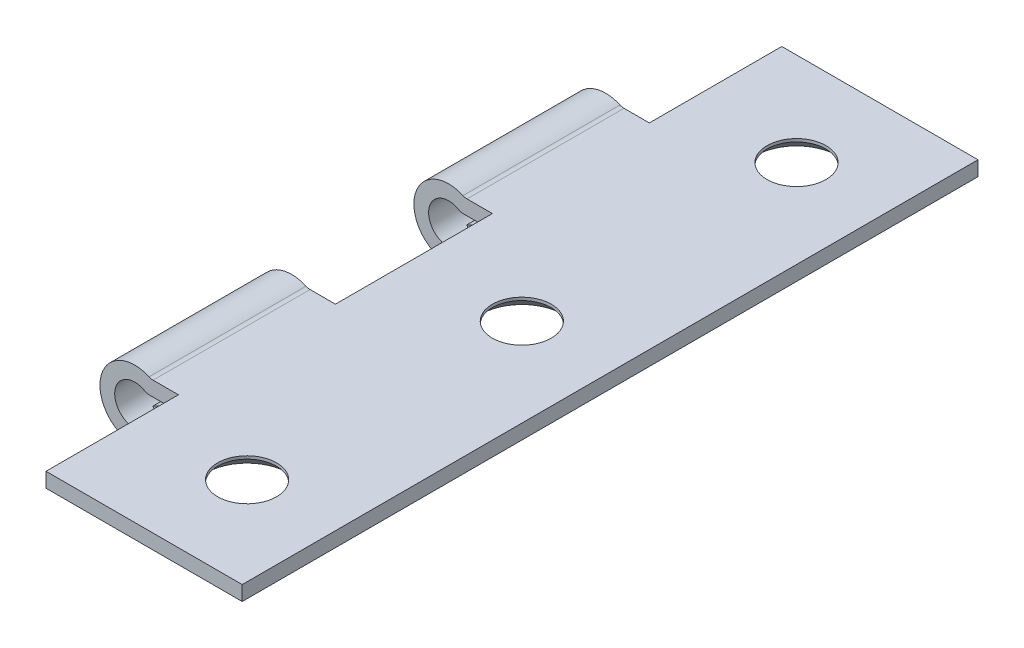
ISO-10303-21;
HEADER;
FILE_DESCRIPTION(('STEP AP214'),'2;1');
FILE_NAME('part.step','',(''),(''),'','','');
FILE_SCHEMA(('AUTOMOTIVE_DESIGN { 1 0 10303 214 1 1 1 1 }'));
ENDSEC;
DATA;
#1=APPLICATION_CONTEXT('core data for automotive mechanical design processes');
#2=APPLICATION_PROTOCOL_DEFINITION('international standard','automotive_design',2000,#1);
#3=PRODUCT_CONTEXT('',#1,'mechanical');
#4=PRODUCT('Part','Part','',(#3));
#5=PRODUCT_RELATED_PRODUCT_CATEGORY('part','',(#4));
#6=PRODUCT_DEFINITION_FORMATION('','',#4);
#7=PRODUCT_DEFINITION_CONTEXT('part definition',#1,'design');
#8=PRODUCT_DEFINITION('design','',#6,#7);
#9=PRODUCT_DEFINITION_SHAPE('','',#8);
#10=(LENGTH_UNIT() NAMED_UNIT(*) SI_UNIT(.MILLI.,.METRE.));
#11=(NAMED_UNIT(*) PLANE_ANGLE_UNIT() SI_UNIT($,.RADIAN.));
#12=(NAMED_UNIT(*) SI_UNIT($,.STERADIAN.) SOLID_ANGLE_UNIT());
#13=UNCERTAINTY_MEASURE_WITH_UNIT(LENGTH_MEASURE(1.E-05),#10,'distance_accuracy_value','');
#14=(GEOMETRIC_REPRESENTATION_CONTEXT(3) GLOBAL_UNCERTAINTY_ASSIGNED_CONTEXT((#13)) GLOBAL_UNIT_ASSIGNED_CONTEXT((#10,
#11,#12)) REPRESENTATION_CONTEXT('',''));
#15=CARTESIAN_POINT('',(0.,0.,0.));
#16=DIRECTION('',(0.,0.,1.));
#17=DIRECTION('',(1.,0.,0.));
#18=AXIS2_PLACEMENT_3D('',#15,#16,#17);
#19=CARTESIAN_POINT('',(0.,0.,37.5));
#20=DIRECTION('',(0.,0.,-1.));
#21=DIRECTION('',(-1.,0.,0.));
#22=AXIS2_PLACEMENT_3D('',#19,#20,#21);
#23=CYLINDRICAL_SURFACE('',#22,3.55);
#24=CARTESIAN_POINT('',(0.,0.,24.));
#25=DIRECTION('',(0.,0.,-1.));
#26=DIRECTION('',(-1.,0.,0.));
#27=AXIS2_PLACEMENT_3D('',#24,#25,#26);
#28=CIRCLE('',#27,3.55);
#29=CARTESIAN_POINT('',(3.21739264398012,1.50029482917946,24.));
#30=VERTEX_POINT('',#29);
#31=CARTESIAN_POINT('',(1.45548112696551,3.23791208791209,24.));
#32=VERTEX_POINT('',#31);
#33=EDGE_CURVE('E219',#30,#32,#28,.T.);
#34=ORIENTED_EDGE('',*,*,#33,.T.);
#35=DIRECTION('',(0.,0.,-1.));
#36=VECTOR('',#35,1.);
#37=CARTESIAN_POINT('',(1.45548112696551,3.23791208791209,37.5));
#38=LINE('',#37,#36);
#39=CARTESIAN_POINT('',(1.45548112696551,3.23791208791209,8.));
#40=VERTEX_POINT('',#39);
#41=EDGE_CURVE('E290',#32,#40,#38,.T.);
#42=ORIENTED_EDGE('',*,*,#41,.T.);
#43=CARTESIAN_POINT('',(0.,0.,8.));
#44=DIRECTION('',(0.,0.,1.));
#45=DIRECTION('',(1.,0.,0.));
#46=AXIS2_PLACEMENT_3D('',#43,#44,#45);
#47=CIRCLE('',#46,3.55);
#48=CARTESIAN_POINT('',(3.21739264398012,1.50029482917946,8.));
#49=VERTEX_POINT('',#48);
#50=EDGE_CURVE('E259',#40,#49,#47,.T.);
#51=ORIENTED_EDGE('',*,*,#50,.T.);
#52=DIRECTION('',(0.,0.,-1.));
#53=VECTOR('',#52,1.);
#54=CARTESIAN_POINT('',(3.21739264398012,1.50029482917946,37.5));
#55=LINE('',#54,#53);
#56=EDGE_CURVE('E310',#30,#49,#55,.T.);
#57=ORIENTED_EDGE('',*,*,#56,.F.);
#58=EDGE_LOOP('',(#34,#42,#51,#57));
#59=FACE_BOUND('',#58,.T.);
#60=ADVANCED_FACE('F34',(#59),#23,.T.);
#61=CARTESIAN_POINT('',(0.,0.,-24.));
#62=DIRECTION('',(0.,0.,1.));
#63=DIRECTION('',(1.,0.,0.));
#64=AXIS2_PLACEMENT_3D('',#61,#62,#63);
#65=CIRCLE('',#64,3.55);
#66=CARTESIAN_POINT('',(1.45548112696551,3.23791208791209,-24.));
#67=VERTEX_POINT('',#66);
#68=CARTESIAN_POINT('',(3.21739264398012,1.50029482917946,-24.));
#69=VERTEX_POINT('',#68);
#70=EDGE_CURVE('E182',#67,#69,#65,.T.);
#71=ORIENTED_EDGE('',*,*,#70,.T.);
#72=CARTESIAN_POINT('',(3.21739264398012,1.50029482917946,-8.));
#73=VERTEX_POINT('',#72);
#74=EDGE_CURVE('E309',#73,#69,#55,.T.);
#75=ORIENTED_EDGE('',*,*,#74,.F.);
#76=CARTESIAN_POINT('',(0.,0.,-8.));
#77=DIRECTION('',(0.,0.,-1.));
#78=DIRECTION('',(-1.,0.,0.));
#79=AXIS2_PLACEMENT_3D('',#76,#77,#78);
#80=CIRCLE('',#79,3.55);
#81=CARTESIAN_POINT('',(1.45548112696551,3.23791208791209,-8.));
#82=VERTEX_POINT('',#81);
#83=EDGE_CURVE('E242',#73,#82,#80,.T.);
#84=ORIENTED_EDGE('',*,*,#83,.T.);
#85=EDGE_CURVE('E285',#82,#67,#38,.T.);
#86=ORIENTED_EDGE('',*,*,#85,.T.);
#87=EDGE_LOOP('',(#71,#75,#84,#86));
#88=FACE_BOUND('',#87,.T.);
#89=ADVANCED_FACE('F367',(#88),#23,.T.);
#90=CARTESIAN_POINT('',(3.21739264398012,1.50029482917946,37.5));
#91=DIRECTION('',(0.422618261740694,-0.906307787036652,0.));
#92=DIRECTION('',(0.906307787036652,0.422618261740694,0.));
#93=AXIS2_PLACEMENT_3D('',#90,#91,#92);
#94=PLANE('',#93);
#95=DIRECTION('',(0.,0.,-1.));
#96=VECTOR('',#95,1.);
#97=CARTESIAN_POINT('',(1.85793096342514,0.866367436568422,37.5));
#98=LINE('',#97,#96);
#99=CARTESIAN_POINT('',(1.85793096342514,0.866367436568422,24.));
#100=VERTEX_POINT('',#99);
#101=CARTESIAN_POINT('',(1.85793096342514,0.866367436568422,8.));
#102=VERTEX_POINT('',#101);
#103=EDGE_CURVE('E307',#100,#102,#98,.T.);
#104=ORIENTED_EDGE('',*,*,#103,.F.);
#105=DIRECTION('',(0.906307787036652,0.422618261740694,0.));
#106=VECTOR('',#105,1.);
#107=CARTESIAN_POINT('',(3.21739264398012,1.50029482917946,24.));
#108=LINE('',#107,#106);
#109=EDGE_CURVE('E221',#100,#30,#108,.T.);
#110=ORIENTED_EDGE('',*,*,#109,.T.);
#111=ORIENTED_EDGE('',*,*,#56,.T.);
#112=DIRECTION('',(-0.906307787036652,-0.422618261740694,0.));
#113=VECTOR('',#112,1.);
#114=CARTESIAN_POINT('',(3.21739264398012,1.50029482917946,8.));
#115=LINE('',#114,#113);
#116=EDGE_CURVE('E262',#49,#102,#115,.T.);
#117=ORIENTED_EDGE('',*,*,#116,.T.);
#118=EDGE_LOOP('',(#104,#110,#111,#117));
#119=FACE_BOUND('',#118,.T.);
#120=ADVANCED_FACE('F373',(#119),#94,.F.);
#121=CARTESIAN_POINT('',(0.,0.,37.5));
#122=DIRECTION('',(0.,0.,-1.));
#123=DIRECTION('',(-1.,0.,0.));
#124=AXIS2_PLACEMENT_3D('',#121,#122,#123);
#125=CYLINDRICAL_SURFACE('',#124,2.05);
#126=DIRECTION('',(0.,0.,-1.));
#127=VECTOR('',#126,1.);
#128=CARTESIAN_POINT('',(1.01489577654459,1.78114754098361,37.5));
#129=LINE('',#128,#127);
#130=CARTESIAN_POINT('',(1.01489577654459,1.78114754098361,24.));
#131=VERTEX_POINT('',#130);
#132=CARTESIAN_POINT('',(1.01489577654459,1.78114754098361,8.));
#133=VERTEX_POINT('',#132);
#134=EDGE_CURVE('E304',#131,#133,#129,.T.);
#135=ORIENTED_EDGE('',*,*,#134,.F.);
#136=CARTESIAN_POINT('',(0.,0.,24.));
#137=DIRECTION('',(0.,0.,-1.));
#138=DIRECTION('',(-1.,0.,0.));
#139=AXIS2_PLACEMENT_3D('',#136,#137,#138);
#140=CIRCLE('',#139,2.05);
#141=EDGE_CURVE('E224',#131,#100,#140,.F.);
#142=ORIENTED_EDGE('',*,*,#141,.T.);
#143=ORIENTED_EDGE('',*,*,#103,.T.);
#144=CARTESIAN_POINT('',(0.,0.,8.));
#145=DIRECTION('',(0.,0.,1.));
#146=DIRECTION('',(1.,0.,0.));
#147=AXIS2_PLACEMENT_3D('',#144,#145,#146);
#148=CIRCLE('',#147,2.05);
#149=EDGE_CURVE('E265',#102,#133,#148,.F.);
#150=ORIENTED_EDGE('',*,*,#149,.T.);
#151=EDGE_LOOP('',(#135,#142,#143,#150));
#152=FACE_BOUND('',#151,.T.);
#153=ADVANCED_FACE('F386',(#152),#125,.F.);
#154=CARTESIAN_POINT('',(1.50996688705415,2.65,37.5));
#155=DIRECTION('',(0.,0.,-1.));
#156=DIRECTION('',(-1.,0.,0.));
#157=AXIS2_PLACEMENT_3D('',#154,#155,#156);
#158=CYLINDRICAL_SURFACE('',#157,1.);
#159=DIRECTION('',(0.,0.,-1.));
#160=VECTOR('',#159,1.);
#161=CARTESIAN_POINT('',(1.50996688705415,1.65,37.5));
#162=LINE('',#161,#160);
#163=CARTESIAN_POINT('',(1.50996688705415,1.65,24.));
#164=VERTEX_POINT('',#163);
#165=CARTESIAN_POINT('',(1.50996688705415,1.65,8.));
#166=VERTEX_POINT('',#165);
#167=EDGE_CURVE('E301',#164,#166,#162,.T.);
#168=ORIENTED_EDGE('',*,*,#167,.F.);
#169=CARTESIAN_POINT('',(1.50996688705415,2.65,24.));
#170=DIRECTION('',(0.,0.,-1.));
#171=DIRECTION('',(-1.,0.,0.));
#172=AXIS2_PLACEMENT_3D('',#169,#170,#171);
#173=CIRCLE('',#172,1.);
#174=EDGE_CURVE('E227',#164,#131,#173,.T.);
#175=ORIENTED_EDGE('',*,*,#174,.T.);
#176=ORIENTED_EDGE('',*,*,#134,.T.);
#177=CARTESIAN_POINT('',(1.50996688705415,2.65,8.));
#178=DIRECTION('',(0.,0.,1.));
#179=DIRECTION('',(1.,0.,0.));
#180=AXIS2_PLACEMENT_3D('',#177,#178,#179);
#181=CIRCLE('',#180,1.);
#182=EDGE_CURVE('E268',#133,#166,#181,.T.);
#183=ORIENTED_EDGE('',*,*,#182,.T.);
#184=EDGE_LOOP('',(#168,#175,#176,#183));
#185=FACE_BOUND('',#184,.T.);
#186=ADVANCED_FACE('F391',(#185),#158,.T.);
#187=CARTESIAN_POINT('',(1.86547581061776,4.15,37.5));
#188=DIRECTION('',(0.,0.,-1.));
#189=DIRECTION('',(-1.,0.,0.));
#190=AXIS2_PLACEMENT_3D('',#187,#188,#189);
#191=CYLINDRICAL_SURFACE('',#190,1.);
#192=ORIENTED_EDGE('',*,*,#41,.F.);
#193=CARTESIAN_POINT('',(1.86547581061776,4.15,24.));
#194=DIRECTION('',(0.,0.,-1.));
#195=DIRECTION('',(-1.,0.,0.));
#196=AXIS2_PLACEMENT_3D('',#193,#194,#195);
#197=CIRCLE('',#196,1.);
#198=CARTESIAN_POINT('',(1.86547581061776,3.15,24.));
#199=VERTEX_POINT('',#198);
#200=EDGE_CURVE('E216',#32,#199,#197,.F.);
#201=ORIENTED_EDGE('',*,*,#200,.T.);
#202=DIRECTION('',(0.,0.,-1.));
#203=VECTOR('',#202,1.);
#204=CARTESIAN_POINT('',(1.86547581061776,3.15,37.5));
#205=LINE('',#204,#203);
#206=CARTESIAN_POINT('',(1.86547581061776,3.15,8.));
#207=VERTEX_POINT('',#206);
#208=EDGE_CURVE('E293',#199,#207,#205,.T.);
#209=ORIENTED_EDGE('',*,*,#208,.T.);
#210=CARTESIAN_POINT('',(1.86547581061776,4.15,8.));
#211=DIRECTION('',(0.,0.,1.));
#212=DIRECTION('',(1.,0.,0.));
#213=AXIS2_PLACEMENT_3D('',#210,#211,#212);
#214=CIRCLE('',#213,1.);
#215=EDGE_CURVE('E315',#207,#40,#214,.F.);
#216=ORIENTED_EDGE('',*,*,#215,.T.);
#217=EDGE_LOOP('',(#192,#201,#209,#216));
#218=FACE_BOUND('',#217,.T.);
#219=ADVANCED_FACE('F380',(#218),#191,.F.);
#220=ORIENTED_EDGE('',*,*,#74,.T.);
#221=DIRECTION('',(-0.906307787036652,-0.422618261740694,0.));
#222=VECTOR('',#221,1.);
#223=CARTESIAN_POINT('',(3.21739264398012,1.50029482917946,-24.));
#224=LINE('',#223,#222);
#225=CARTESIAN_POINT('',(1.85793096342514,0.866367436568422,-24.));
#226=VERTEX_POINT('',#225);
#227=EDGE_CURVE('E205',#69,#226,#224,.T.);
#228=ORIENTED_EDGE('',*,*,#227,.T.);
#229=CARTESIAN_POINT('',(1.85793096342514,0.866367436568422,-8.));
#230=VERTEX_POINT('',#229);
#231=EDGE_CURVE('E306',#230,#226,#98,.T.);
#232=ORIENTED_EDGE('',*,*,#231,.F.);
#233=DIRECTION('',(0.906307787036652,0.422618261740694,0.));
#234=VECTOR('',#233,1.);
#235=CARTESIAN_POINT('',(3.21739264398012,1.50029482917946,-8.));
#236=LINE('',#235,#234);
#237=EDGE_CURVE('E244',#230,#73,#236,.T.);
#238=ORIENTED_EDGE('',*,*,#237,.T.);
#239=EDGE_LOOP('',(#220,#228,#232,#238));
#240=FACE_BOUND('',#239,.T.);
#241=ADVANCED_FACE('F376',(#240),#94,.F.);
#242=ORIENTED_EDGE('',*,*,#231,.T.);
#243=CARTESIAN_POINT('',(0.,0.,-24.));
#244=DIRECTION('',(0.,0.,1.));
#245=DIRECTION('',(1.,0.,0.));
#246=AXIS2_PLACEMENT_3D('',#243,#244,#245);
#247=CIRCLE('',#246,2.05);
#248=CARTESIAN_POINT('',(1.01489577654459,1.78114754098361,-24.));
#249=VERTEX_POINT('',#248);
#250=EDGE_CURVE('E208',#226,#249,#247,.F.);
#251=ORIENTED_EDGE('',*,*,#250,.T.);
#252=CARTESIAN_POINT('',(1.01489577654459,1.78114754098361,-8.));
#253=VERTEX_POINT('',#252);
#254=EDGE_CURVE('E303',#253,#249,#129,.T.);
#255=ORIENTED_EDGE('',*,*,#254,.F.);
#256=CARTESIAN_POINT('',(0.,0.,-8.));
#257=DIRECTION('',(0.,0.,-1.));
#258=DIRECTION('',(-1.,0.,0.));
#259=AXIS2_PLACEMENT_3D('',#256,#257,#258);
#260=CIRCLE('',#259,2.05);
#261=EDGE_CURVE('E247',#253,#230,#260,.F.);
#262=ORIENTED_EDGE('',*,*,#261,.T.);
#263=EDGE_LOOP('',(#242,#251,#255,#262));
#264=FACE_BOUND('',#263,.T.);
#265=ADVANCED_FACE('F379',(#264),#125,.F.);
#266=ORIENTED_EDGE('',*,*,#254,.T.);
#267=CARTESIAN_POINT('',(1.50996688705415,2.65,-24.));
#268=DIRECTION('',(0.,0.,1.));
#269=DIRECTION('',(1.,0.,0.));
#270=AXIS2_PLACEMENT_3D('',#267,#268,#269);
#271=CIRCLE('',#270,1.);
#272=CARTESIAN_POINT('',(1.50996688705415,1.65,-24.));
#273=VERTEX_POINT('',#272);
#274=EDGE_CURVE('E211',#249,#273,#271,.T.);
#275=ORIENTED_EDGE('',*,*,#274,.T.);
#276=CARTESIAN_POINT('',(1.50996688705415,1.65,-8.));
#277=VERTEX_POINT('',#276);
#278=EDGE_CURVE('E300',#277,#273,#162,.T.);
#279=ORIENTED_EDGE('',*,*,#278,.F.);
#280=CARTESIAN_POINT('',(1.50996688705415,2.65,-8.));
#281=DIRECTION('',(0.,0.,-1.));
#282=DIRECTION('',(-1.,0.,0.));
#283=AXIS2_PLACEMENT_3D('',#280,#281,#282);
#284=CIRCLE('',#283,1.);
#285=EDGE_CURVE('E250',#277,#253,#284,.T.);
#286=ORIENTED_EDGE('',*,*,#285,.T.);
#287=EDGE_LOOP('',(#266,#275,#279,#286));
#288=FACE_BOUND('',#287,.T.);
#289=ADVANCED_FACE('F384',(#288),#158,.T.);
#290=CARTESIAN_POINT('',(1.50996688705415,1.65,37.5));
#291=DIRECTION('',(0.,1.,0.));
#292=DIRECTION('',(0.,0.,1.));
#293=AXIS2_PLACEMENT_3D('',#290,#291,#292);
#294=PLANE('',#293);
#295=CARTESIAN_POINT('',(15.45,1.65,-28.));
#296=DIRECTION('',(0.,1.,0.));
#297=DIRECTION('',(0.,0.,1.));
#298=AXIS2_PLACEMENT_3D('',#295,#296,#297);
#299=CIRCLE('',#298,4.20000000000001);
#300=CARTESIAN_POINT('',(15.45,1.65,-23.8));
#301=VERTEX_POINT('',#300);
#302=EDGE_CURVE('E345',#301,#301,#299,.T.);
#303=ORIENTED_EDGE('',*,*,#302,.T.);
#304=EDGE_LOOP('',(#303));
#305=FACE_BOUND('',#304,.T.);
#306=CARTESIAN_POINT('',(15.45,1.65,0.));
#307=DIRECTION('',(0.,1.,0.));
#308=DIRECTION('',(0.,0.,1.));
#309=AXIS2_PLACEMENT_3D('',#306,#307,#308);
#310=CIRCLE('',#309,4.20000000000003);
#311=CARTESIAN_POINT('',(15.45,1.65,4.20000000000003));
#312=VERTEX_POINT('',#311);
#313=EDGE_CURVE('E342',#312,#312,#310,.T.);
#314=ORIENTED_EDGE('',*,*,#313,.T.);
#315=EDGE_LOOP('',(#314));
#316=FACE_BOUND('',#315,.T.);
#317=CARTESIAN_POINT('',(15.45,1.65,28.));
#318=DIRECTION('',(0.,1.,0.));
#319=DIRECTION('',(0.,0.,1.));
#320=AXIS2_PLACEMENT_3D('',#317,#318,#319);
#321=CIRCLE('',#320,4.19999999999998);
#322=CARTESIAN_POINT('',(15.45,1.65,32.2));
#323=VERTEX_POINT('',#322);
#324=EDGE_CURVE('E339',#323,#323,#321,.T.);
#325=ORIENTED_EDGE('',*,*,#324,.T.);
#326=EDGE_LOOP('',(#325));
#327=FACE_BOUND('',#326,.T.);
#328=DIRECTION('',(1.,0.,0.));
#329=VECTOR('',#328,1.);
#330=CARTESIAN_POINT('',(1.50996688705415,1.65,37.5));
#331=LINE('',#330,#329);
#332=CARTESIAN_POINT('',(4.45,1.65,37.5));
#333=VERTEX_POINT('',#332);
#334=CARTESIAN_POINT('',(24.45,1.65,37.5));
#335=VERTEX_POINT('',#334);
#336=EDGE_CURVE('E278',#333,#335,#331,.T.);
#337=ORIENTED_EDGE('',*,*,#336,.F.);
#338=DIRECTION('',(0.,0.,-1.));
#339=VECTOR('',#338,1.);
#340=CARTESIAN_POINT('',(4.45,1.65,37.5));
#341=LINE('',#340,#339);
#342=CARTESIAN_POINT('',(4.45,1.65,24.));
#343=VERTEX_POINT('',#342);
#344=EDGE_CURVE('E49',#333,#343,#341,.T.);
#345=ORIENTED_EDGE('',*,*,#344,.T.);
#346=DIRECTION('',(-1.,0.,0.));
#347=VECTOR('',#346,1.);
#348=CARTESIAN_POINT('',(1.50996688705415,1.65,24.));
#349=LINE('',#348,#347);
#350=EDGE_CURVE('E230',#343,#164,#349,.T.);
#351=ORIENTED_EDGE('',*,*,#350,.T.);
#352=ORIENTED_EDGE('',*,*,#167,.T.);
#353=DIRECTION('',(1.,0.,0.));
#354=VECTOR('',#353,1.);
#355=CARTESIAN_POINT('',(1.50996688705415,1.65,8.));
#356=LINE('',#355,#354);
#357=CARTESIAN_POINT('',(4.45,1.65,8.));
#358=VERTEX_POINT('',#357);
#359=EDGE_CURVE('E271',#166,#358,#356,.T.);
#360=ORIENTED_EDGE('',*,*,#359,.T.);
#361=DIRECTION('',(0.,0.,-1.));
#362=VECTOR('',#361,1.);
#363=CARTESIAN_POINT('',(4.45,1.65,37.5));
#364=LINE('',#363,#362);
#365=CARTESIAN_POINT('',(4.45,1.65,-8.));
#366=VERTEX_POINT('',#365);
#367=EDGE_CURVE('E274',#358,#366,#364,.T.);
#368=ORIENTED_EDGE('',*,*,#367,.T.);
#369=DIRECTION('',(-1.,0.,0.));
#370=VECTOR('',#369,1.);
#371=CARTESIAN_POINT('',(1.50996688705415,1.65,-8.));
#372=LINE('',#371,#370);
#373=EDGE_CURVE('E253',#366,#277,#372,.T.);
#374=ORIENTED_EDGE('',*,*,#373,.T.);
#375=ORIENTED_EDGE('',*,*,#278,.T.);
#376=DIRECTION('',(1.,0.,0.));
#377=VECTOR('',#376,1.);
#378=CARTESIAN_POINT('',(1.50996688705415,1.65,-24.));
#379=LINE('',#378,#377);
#380=CARTESIAN_POINT('',(4.45000000000001,1.65,-24.));
#381=VERTEX_POINT('',#380);
#382=EDGE_CURVE('E214',#273,#381,#379,.T.);
#383=ORIENTED_EDGE('',*,*,#382,.T.);
#384=DIRECTION('',(0.,0.,-1.));
#385=VECTOR('',#384,1.);
#386=CARTESIAN_POINT('',(4.45,1.65,37.5));
#387=LINE('',#386,#385);
#388=CARTESIAN_POINT('',(4.45000000000001,1.65,-37.5));
#389=VERTEX_POINT('',#388);
#390=EDGE_CURVE('E186',#381,#389,#387,.T.);
#391=ORIENTED_EDGE('',*,*,#390,.T.);
#392=DIRECTION('',(1.,0.,0.));
#393=VECTOR('',#392,1.);
#394=CARTESIAN_POINT('',(1.50996688705415,1.65,-37.5));
#395=LINE('',#394,#393);
#396=CARTESIAN_POINT('',(24.45,1.65,-37.5));
#397=VERTEX_POINT('',#396);
#398=EDGE_CURVE('E277',#389,#397,#395,.T.);
#399=ORIENTED_EDGE('',*,*,#398,.T.);
#400=DIRECTION('',(0.,0.,-1.));
#401=VECTOR('',#400,1.);
#402=CARTESIAN_POINT('',(24.45,1.65,37.5));
#403=LINE('',#402,#401);
#404=EDGE_CURVE('E297',#335,#397,#403,.T.);
#405=ORIENTED_EDGE('',*,*,#404,.F.);
#406=EDGE_LOOP('',(#337,#345,#351,#352,#360,#368,#374,#375,#383,#391,#399,#405));
#407=FACE_BOUND('',#406,.T.);
#408=ADVANCED_FACE('F389',(#305,#316,#327,#407),#294,.F.);
#409=CARTESIAN_POINT('',(24.45,3.15,37.5));
#410=DIRECTION('',(-1.,0.,0.));
#411=DIRECTION('',(0.,0.,1.));
#412=AXIS2_PLACEMENT_3D('',#409,#410,#411);
#413=PLANE('',#412);
#414=DIRECTION('',(0.,1.,0.));
#415=VECTOR('',#414,1.);
#416=CARTESIAN_POINT('',(24.45,3.15,-37.5));
#417=LINE('',#416,#415);
#418=CARTESIAN_POINT('',(24.45,3.15,-37.5));
#419=VERTEX_POINT('',#418);
#420=EDGE_CURVE('E287',#397,#419,#417,.T.);
#421=ORIENTED_EDGE('',*,*,#420,.T.);
#422=DIRECTION('',(0.,0.,-1.));
#423=VECTOR('',#422,1.);
#424=CARTESIAN_POINT('',(24.45,3.15,37.5));
#425=LINE('',#424,#423);
#426=CARTESIAN_POINT('',(24.45,3.15,37.5));
#427=VERTEX_POINT('',#426);
#428=EDGE_CURVE('E295',#427,#419,#425,.T.);
#429=ORIENTED_EDGE('',*,*,#428,.F.);
#430=DIRECTION('',(0.,1.,0.));
#431=VECTOR('',#430,1.);
#432=CARTESIAN_POINT('',(24.45,3.15,37.5));
#433=LINE('',#432,#431);
#434=EDGE_CURVE('E280',#335,#427,#433,.T.);
#435=ORIENTED_EDGE('',*,*,#434,.F.);
#436=ORIENTED_EDGE('',*,*,#404,.T.);
#437=EDGE_LOOP('',(#421,#429,#435,#436));
#438=FACE_BOUND('',#437,.T.);
#439=ADVANCED_FACE('F394',(#438),#413,.F.);
#440=CARTESIAN_POINT('',(1.86547581061776,3.15,37.5));
#441=DIRECTION('',(0.,-1.,0.));
#442=DIRECTION('',(1.,0.,0.));
#443=AXIS2_PLACEMENT_3D('',#440,#441,#442);
#444=PLANE('',#443);
#445=CARTESIAN_POINT('',(15.45,3.15,28.));
#446=DIRECTION('',(0.,-1.,0.));
#447=DIRECTION('',(1.,0.,0.));
#448=AXIS2_PLACEMENT_3D('',#445,#446,#447);
#449=CIRCLE('',#448,3.);
#450=CARTESIAN_POINT('',(18.45,3.15,28.));
#451=VERTEX_POINT('',#450);
#452=EDGE_CURVE('E334',#451,#451,#449,.F.);
#453=ORIENTED_EDGE('',*,*,#452,.F.);
#454=EDGE_LOOP('',(#453));
#455=FACE_BOUND('',#454,.T.);
#456=CARTESIAN_POINT('',(15.45,3.15,-28.));
#457=DIRECTION('',(0.,-1.,0.));
#458=DIRECTION('',(1.,0.,0.));
#459=AXIS2_PLACEMENT_3D('',#456,#457,#458);
#460=CIRCLE('',#459,3.);
#461=CARTESIAN_POINT('',(18.45,3.15,-28.));
#462=VERTEX_POINT('',#461);
#463=EDGE_CURVE('E331',#462,#462,#460,.T.);
#464=ORIENTED_EDGE('',*,*,#463,.T.);
#465=EDGE_LOOP('',(#464));
#466=FACE_BOUND('',#465,.T.);
#467=CARTESIAN_POINT('',(15.45,3.15,0.));
#468=DIRECTION('',(0.,-1.,0.));
#469=DIRECTION('',(1.,0.,0.));
#470=AXIS2_PLACEMENT_3D('',#467,#468,#469);
#471=CIRCLE('',#470,3.);
#472=CARTESIAN_POINT('',(18.45,3.15,0.));
#473=VERTEX_POINT('',#472);
#474=EDGE_CURVE('E188',#473,#473,#471,.T.);
#475=ORIENTED_EDGE('',*,*,#474,.T.);
#476=EDGE_LOOP('',(#475));
#477=FACE_BOUND('',#476,.T.);
#478=DIRECTION('',(1.,0.,0.));
#479=VECTOR('',#478,1.);
#480=CARTESIAN_POINT('',(1.86547581061776,3.15,24.));
#481=LINE('',#480,#479);
#482=CARTESIAN_POINT('',(4.45,3.15,24.));
#483=VERTEX_POINT('',#482);
#484=EDGE_CURVE('E326',#199,#483,#481,.T.);
#485=ORIENTED_EDGE('',*,*,#484,.T.);
#486=DIRECTION('',(0.,0.,1.));
#487=VECTOR('',#486,1.);
#488=CARTESIAN_POINT('',(4.45,3.15,37.5));
#489=LINE('',#488,#487);
#490=CARTESIAN_POINT('',(4.45,3.15,37.5));
#491=VERTEX_POINT('',#490);
#492=EDGE_CURVE('E197',#483,#491,#489,.T.);
#493=ORIENTED_EDGE('',*,*,#492,.T.);
#494=DIRECTION('',(-1.,0.,0.));
#495=VECTOR('',#494,1.);
#496=CARTESIAN_POINT('',(1.86547581061776,3.15,37.5));
#497=LINE('',#496,#495);
#498=EDGE_CURVE('E282',#427,#491,#497,.T.);
#499=ORIENTED_EDGE('',*,*,#498,.F.);
#500=ORIENTED_EDGE('',*,*,#428,.T.);
#501=DIRECTION('',(-1.,0.,0.));
#502=VECTOR('',#501,1.);
#503=CARTESIAN_POINT('',(1.86547581061776,3.15,-37.5));
#504=LINE('',#503,#502);
#505=CARTESIAN_POINT('',(4.45000000000001,3.15,-37.5));
#506=VERTEX_POINT('',#505);
#507=EDGE_CURVE('E195',#419,#506,#504,.T.);
#508=ORIENTED_EDGE('',*,*,#507,.T.);
#509=DIRECTION('',(0.,0.,1.));
#510=VECTOR('',#509,1.);
#511=CARTESIAN_POINT('',(4.45,3.15,37.5));
#512=LINE('',#511,#510);
#513=CARTESIAN_POINT('',(4.45000000000001,3.15,-24.));
#514=VERTEX_POINT('',#513);
#515=EDGE_CURVE('E57',#506,#514,#512,.T.);
#516=ORIENTED_EDGE('',*,*,#515,.T.);
#517=DIRECTION('',(-1.,0.,0.));
#518=VECTOR('',#517,1.);
#519=CARTESIAN_POINT('',(1.86547581061776,3.15,-24.));
#520=LINE('',#519,#518);
#521=CARTESIAN_POINT('',(1.86547581061776,3.15,-24.));
#522=VERTEX_POINT('',#521);
#523=EDGE_CURVE('E173',#514,#522,#520,.T.);
#524=ORIENTED_EDGE('',*,*,#523,.T.);
#525=CARTESIAN_POINT('',(1.86547581061776,3.15,-8.));
#526=VERTEX_POINT('',#525);
#527=EDGE_CURVE('E292',#526,#522,#205,.T.);
#528=ORIENTED_EDGE('',*,*,#527,.F.);
#529=DIRECTION('',(1.,0.,0.));
#530=VECTOR('',#529,1.);
#531=CARTESIAN_POINT('',(1.86547581061776,3.15,-8.));
#532=LINE('',#531,#530);
#533=CARTESIAN_POINT('',(4.45,3.15,-8.));
#534=VERTEX_POINT('',#533);
#535=EDGE_CURVE('E237',#526,#534,#532,.T.);
#536=ORIENTED_EDGE('',*,*,#535,.T.);
#537=DIRECTION('',(0.,0.,1.));
#538=VECTOR('',#537,1.);
#539=CARTESIAN_POINT('',(4.45,3.15,37.5));
#540=LINE('',#539,#538);
#541=CARTESIAN_POINT('',(4.45,3.15,8.));
#542=VERTEX_POINT('',#541);
#543=EDGE_CURVE('E318',#534,#542,#540,.T.);
#544=ORIENTED_EDGE('',*,*,#543,.T.);
#545=DIRECTION('',(-1.,0.,0.));
#546=VECTOR('',#545,1.);
#547=CARTESIAN_POINT('',(1.86547581061776,3.15,8.));
#548=LINE('',#547,#546);
#549=EDGE_CURVE('E256',#542,#207,#548,.T.);
#550=ORIENTED_EDGE('',*,*,#549,.T.);
#551=ORIENTED_EDGE('',*,*,#208,.F.);
#552=EDGE_LOOP('',(#485,#493,#499,#500,#508,#516,#524,#528,#536,#544,#550,#551));
#553=FACE_BOUND('',#552,.T.);
#554=ADVANCED_FACE('F192',(#455,#466,#477,#553),#444,.F.);
#555=ORIENTED_EDGE('',*,*,#527,.T.);
#556=CARTESIAN_POINT('',(1.86547581061776,4.15,-24.));
#557=DIRECTION('',(0.,0.,1.));
#558=DIRECTION('',(1.,0.,0.));
#559=AXIS2_PLACEMENT_3D('',#556,#557,#558);
#560=CIRCLE('',#559,1.);
#561=EDGE_CURVE('E178',#522,#67,#560,.F.);
#562=ORIENTED_EDGE('',*,*,#561,.T.);
#563=ORIENTED_EDGE('',*,*,#85,.F.);
#564=CARTESIAN_POINT('',(1.86547581061776,4.15,-8.));
#565=DIRECTION('',(0.,0.,-1.));
#566=DIRECTION('',(-1.,0.,0.));
#567=AXIS2_PLACEMENT_3D('',#564,#565,#566);
#568=CIRCLE('',#567,1.);
#569=EDGE_CURVE('E312',#82,#526,#568,.F.);
#570=ORIENTED_EDGE('',*,*,#569,.T.);
#571=EDGE_LOOP('',(#555,#562,#563,#570));
#572=FACE_BOUND('',#571,.T.);
#573=ADVANCED_FACE('F401',(#572),#191,.F.);
#574=CARTESIAN_POINT('',(0.,0.,37.5));
#575=DIRECTION('',(0.,0.,1.));
#576=DIRECTION('',(1.,0.,0.));
#577=AXIS2_PLACEMENT_3D('',#574,#575,#576);
#578=PLANE('',#577);
#579=DIRECTION('',(0.,1.,0.));
#580=VECTOR('',#579,1.);
#581=CARTESIAN_POINT('',(4.45,0.,37.5));
#582=LINE('',#581,#580);
#583=EDGE_CURVE('E323',#333,#491,#582,.T.);
#584=ORIENTED_EDGE('',*,*,#583,.F.);
#585=ORIENTED_EDGE('',*,*,#336,.T.);
#586=ORIENTED_EDGE('',*,*,#434,.T.);
#587=ORIENTED_EDGE('',*,*,#498,.T.);
#588=EDGE_LOOP('',(#584,#585,#586,#587));
#589=FACE_BOUND('',#588,.T.);
#590=ADVANCED_FACE('F405',(#589),#578,.T.);
#591=CARTESIAN_POINT('',(0.,0.,-37.5));
#592=DIRECTION('',(0.,0.,1.));
#593=DIRECTION('',(1.,0.,0.));
#594=AXIS2_PLACEMENT_3D('',#591,#592,#593);
#595=PLANE('',#594);
#596=ORIENTED_EDGE('',*,*,#398,.F.);
#597=DIRECTION('',(0.,1.,0.));
#598=VECTOR('',#597,1.);
#599=CARTESIAN_POINT('',(4.45000000000001,0.,-37.5));
#600=LINE('',#599,#598);
#601=EDGE_CURVE('E321',#389,#506,#600,.T.);
#602=ORIENTED_EDGE('',*,*,#601,.T.);
#603=ORIENTED_EDGE('',*,*,#507,.F.);
#604=ORIENTED_EDGE('',*,*,#420,.F.);
#605=EDGE_LOOP('',(#596,#602,#603,#604));
#606=FACE_BOUND('',#605,.T.);
#607=ADVANCED_FACE('F407',(#606),#595,.F.);
#608=CARTESIAN_POINT('',(4.45,3.55,8.));
#609=DIRECTION('',(1.,0.,0.));
#610=DIRECTION('',(0.,0.,-1.));
#611=AXIS2_PLACEMENT_3D('',#608,#609,#610);
#612=PLANE('',#611);
#613=DIRECTION('',(0.,-1.,0.));
#614=VECTOR('',#613,1.);
#615=CARTESIAN_POINT('',(4.45,3.55,8.));
#616=LINE('',#615,#614);
#617=EDGE_CURVE('E234',#542,#358,#616,.T.);
#618=ORIENTED_EDGE('',*,*,#617,.F.);
#619=ORIENTED_EDGE('',*,*,#543,.F.);
#620=DIRECTION('',(0.,-1.,0.));
#621=VECTOR('',#620,1.);
#622=CARTESIAN_POINT('',(4.45,3.55,-8.));
#623=LINE('',#622,#621);
#624=EDGE_CURVE('E233',#534,#366,#623,.T.);
#625=ORIENTED_EDGE('',*,*,#624,.T.);
#626=ORIENTED_EDGE('',*,*,#367,.F.);
#627=EDGE_LOOP('',(#618,#619,#625,#626));
#628=FACE_BOUND('',#627,.T.);
#629=ADVANCED_FACE('F410',(#628),#612,.F.);
#630=CARTESIAN_POINT('',(-3.55,3.55,8.));
#631=DIRECTION('',(0.,0.,1.));
#632=DIRECTION('',(1.,0.,0.));
#633=AXIS2_PLACEMENT_3D('',#630,#631,#632);
#634=PLANE('',#633);
#635=ORIENTED_EDGE('',*,*,#182,.F.);
#636=ORIENTED_EDGE('',*,*,#149,.F.);
#637=ORIENTED_EDGE('',*,*,#116,.F.);
#638=ORIENTED_EDGE('',*,*,#50,.F.);
#639=ORIENTED_EDGE('',*,*,#215,.F.);
#640=ORIENTED_EDGE('',*,*,#549,.F.);
#641=ORIENTED_EDGE('',*,*,#617,.T.);
#642=ORIENTED_EDGE('',*,*,#359,.F.);
#643=EDGE_LOOP('',(#635,#636,#637,#638,#639,#640,#641,#642));
#644=FACE_BOUND('',#643,.T.);
#645=ADVANCED_FACE('F418',(#644),#634,.F.);
#646=CARTESIAN_POINT('',(-3.55,3.55,-8.));
#647=DIRECTION('',(0.,0.,-1.));
#648=DIRECTION('',(-1.,0.,0.));
#649=AXIS2_PLACEMENT_3D('',#646,#647,#648);
#650=PLANE('',#649);
#651=ORIENTED_EDGE('',*,*,#624,.F.);
#652=ORIENTED_EDGE('',*,*,#535,.F.);
#653=ORIENTED_EDGE('',*,*,#569,.F.);
#654=ORIENTED_EDGE('',*,*,#83,.F.);
#655=ORIENTED_EDGE('',*,*,#237,.F.);
#656=ORIENTED_EDGE('',*,*,#261,.F.);
#657=ORIENTED_EDGE('',*,*,#285,.F.);
#658=ORIENTED_EDGE('',*,*,#373,.F.);
#659=EDGE_LOOP('',(#651,#652,#653,#654,#655,#656,#657,#658));
#660=FACE_BOUND('',#659,.T.);
#661=ADVANCED_FACE('F415',(#660),#650,.F.);
#662=CARTESIAN_POINT('',(-3.55,3.55,-24.));
#663=DIRECTION('',(0.,0.,1.));
#664=DIRECTION('',(1.,0.,0.));
#665=AXIS2_PLACEMENT_3D('',#662,#663,#664);
#666=PLANE('',#665);
#667=ORIENTED_EDGE('',*,*,#274,.F.);
#668=ORIENTED_EDGE('',*,*,#250,.F.);
#669=ORIENTED_EDGE('',*,*,#227,.F.);
#670=ORIENTED_EDGE('',*,*,#70,.F.);
#671=ORIENTED_EDGE('',*,*,#561,.F.);
#672=ORIENTED_EDGE('',*,*,#523,.F.);
#673=DIRECTION('',(0.,-1.,0.));
#674=VECTOR('',#673,1.);
#675=CARTESIAN_POINT('',(4.45000000000001,3.55,-24.));
#676=LINE('',#675,#674);
#677=EDGE_CURVE('E175',#514,#381,#676,.T.);
#678=ORIENTED_EDGE('',*,*,#677,.T.);
#679=ORIENTED_EDGE('',*,*,#382,.F.);
#680=EDGE_LOOP('',(#667,#668,#669,#670,#671,#672,#678,#679));
#681=FACE_BOUND('',#680,.T.);
#682=ADVANCED_FACE('F174',(#681),#666,.F.);
#683=CARTESIAN_POINT('',(4.45000000000001,3.55,-24.));
#684=DIRECTION('',(1.,0.,0.));
#685=DIRECTION('',(0.,0.,-1.));
#686=AXIS2_PLACEMENT_3D('',#683,#684,#685);
#687=PLANE('',#686);
#688=ORIENTED_EDGE('',*,*,#677,.F.);
#689=ORIENTED_EDGE('',*,*,#515,.F.);
#690=ORIENTED_EDGE('',*,*,#601,.F.);
#691=ORIENTED_EDGE('',*,*,#390,.F.);
#692=EDGE_LOOP('',(#688,#689,#690,#691));
#693=FACE_BOUND('',#692,.T.);
#694=ADVANCED_FACE('F184',(#693),#687,.F.);
#695=CARTESIAN_POINT('',(-3.55000000000001,3.55,24.));
#696=DIRECTION('',(0.,0.,-1.));
#697=DIRECTION('',(-1.,0.,0.));
#698=AXIS2_PLACEMENT_3D('',#695,#696,#697);
#699=PLANE('',#698);
#700=DIRECTION('',(0.,-1.,0.));
#701=VECTOR('',#700,1.);
#702=CARTESIAN_POINT('',(4.45,3.55,24.));
#703=LINE('',#702,#701);
#704=EDGE_CURVE('E187',#483,#343,#703,.T.);
#705=ORIENTED_EDGE('',*,*,#704,.F.);
#706=ORIENTED_EDGE('',*,*,#484,.F.);
#707=ORIENTED_EDGE('',*,*,#200,.F.);
#708=ORIENTED_EDGE('',*,*,#33,.F.);
#709=ORIENTED_EDGE('',*,*,#109,.F.);
#710=ORIENTED_EDGE('',*,*,#141,.F.);
#711=ORIENTED_EDGE('',*,*,#174,.F.);
#712=ORIENTED_EDGE('',*,*,#350,.F.);
#713=EDGE_LOOP('',(#705,#706,#707,#708,#709,#710,#711,#712));
#714=FACE_BOUND('',#713,.T.);
#715=ADVANCED_FACE('F428',(#714),#699,.F.);
#716=CARTESIAN_POINT('',(4.45,3.55,37.5));
#717=DIRECTION('',(1.,0.,0.));
#718=DIRECTION('',(0.,0.,-1.));
#719=AXIS2_PLACEMENT_3D('',#716,#717,#718);
#720=PLANE('',#719);
#721=ORIENTED_EDGE('',*,*,#583,.T.);
#722=ORIENTED_EDGE('',*,*,#492,.F.);
#723=ORIENTED_EDGE('',*,*,#704,.T.);
#724=ORIENTED_EDGE('',*,*,#344,.F.);
#725=EDGE_LOOP('',(#721,#722,#723,#724));
#726=FACE_BOUND('',#725,.T.);
#727=ADVANCED_FACE('F433',(#726),#720,.F.);
#728=CARTESIAN_POINT('',(15.45,3.55,0.));
#729=DIRECTION('',(0.,-1.,0.));
#730=DIRECTION('',(0.,0.,-1.));
#731=AXIS2_PLACEMENT_3D('',#728,#729,#730);
#732=CYLINDRICAL_SURFACE('',#731,3.);
#733=CARTESIAN_POINT('',(15.45,2.85000000000003,0.));
#734=DIRECTION('',(0.,1.,0.));
#735=DIRECTION('',(0.,0.,1.));
#736=AXIS2_PLACEMENT_3D('',#733,#734,#735);
#737=CIRCLE('',#736,3.);
#738=CARTESIAN_POINT('',(15.45,2.85000000000003,3.));
#739=VERTEX_POINT('',#738);
#740=EDGE_CURVE('E42',#739,#739,#737,.F.);
#741=ORIENTED_EDGE('',*,*,#740,.T.);
#742=EDGE_LOOP('',(#741));
#743=FACE_BOUND('',#742,.T.);
#744=ORIENTED_EDGE('',*,*,#474,.F.);
#745=EDGE_LOOP('',(#744));
#746=FACE_BOUND('',#745,.T.);
#747=ADVANCED_FACE('F350',(#743,#746),#732,.F.);
#748=CARTESIAN_POINT('',(15.45,3.55,-28.));
#749=DIRECTION('',(0.,-1.,0.));
#750=DIRECTION('',(0.,0.,-1.));
#751=AXIS2_PLACEMENT_3D('',#748,#749,#750);
#752=CYLINDRICAL_SURFACE('',#751,3.);
#753=CARTESIAN_POINT('',(15.45,2.85000000000001,-28.));
#754=DIRECTION('',(0.,1.,0.));
#755=DIRECTION('',(0.,0.,1.));
#756=AXIS2_PLACEMENT_3D('',#753,#754,#755);
#757=CIRCLE('',#756,3.);
#758=CARTESIAN_POINT('',(15.45,2.85000000000001,-25.));
#759=VERTEX_POINT('',#758);
#760=EDGE_CURVE('E328',#759,#759,#757,.F.);
#761=ORIENTED_EDGE('',*,*,#760,.T.);
#762=EDGE_LOOP('',(#761));
#763=FACE_BOUND('',#762,.T.);
#764=ORIENTED_EDGE('',*,*,#463,.F.);
#765=EDGE_LOOP('',(#764));
#766=FACE_BOUND('',#765,.T.);
#767=ADVANCED_FACE('F439',(#763,#766),#752,.F.);
#768=CARTESIAN_POINT('',(15.45,3.55,28.));
#769=DIRECTION('',(0.,-1.,0.));
#770=DIRECTION('',(0.,0.,-1.));
#771=AXIS2_PLACEMENT_3D('',#768,#769,#770);
#772=CYLINDRICAL_SURFACE('',#771,3.);
#773=CARTESIAN_POINT('',(15.45,2.84999999999998,28.));
#774=DIRECTION('',(0.,1.,0.));
#775=DIRECTION('',(0.,0.,1.));
#776=AXIS2_PLACEMENT_3D('',#773,#774,#775);
#777=CIRCLE('',#776,3.);
#778=CARTESIAN_POINT('',(15.45,2.84999999999998,31.));
#779=VERTEX_POINT('',#778);
#780=EDGE_CURVE('E11',#779,#779,#777,.F.);
#781=ORIENTED_EDGE('',*,*,#780,.T.);
#782=EDGE_LOOP('',(#781));
#783=FACE_BOUND('',#782,.T.);
#784=ORIENTED_EDGE('',*,*,#452,.T.);
#785=EDGE_LOOP('',(#784));
#786=FACE_BOUND('',#785,.T.);
#787=ADVANCED_FACE('F362',(#783,#786),#772,.F.);
#788=CARTESIAN_POINT('',(15.45,2.85000000000001,-28.));
#789=DIRECTION('',(0.,-1.,0.));
#790=DIRECTION('',(0.,0.,-1.));
#791=AXIS2_PLACEMENT_3D('',#788,#789,#790);
#792=CONICAL_SURFACE('',#791,3.,0.78539816339745);
#793=ORIENTED_EDGE('',*,*,#302,.F.);
#794=EDGE_LOOP('',(#793));
#795=FACE_BOUND('',#794,.T.);
#796=ORIENTED_EDGE('',*,*,#760,.F.);
#797=EDGE_LOOP('',(#796));
#798=FACE_BOUND('',#797,.T.);
#799=ADVANCED_FACE('F355',(#795,#798),#792,.F.);
#800=CARTESIAN_POINT('',(15.45,2.85000000000003,0.));
#801=DIRECTION('',(0.,-1.,0.));
#802=DIRECTION('',(0.,0.,-1.));
#803=AXIS2_PLACEMENT_3D('',#800,#801,#802);
#804=CONICAL_SURFACE('',#803,3.,0.78539816339745);
#805=ORIENTED_EDGE('',*,*,#313,.F.);
#806=EDGE_LOOP('',(#805));
#807=FACE_BOUND('',#806,.T.);
#808=ORIENTED_EDGE('',*,*,#740,.F.);
#809=EDGE_LOOP('',(#808));
#810=FACE_BOUND('',#809,.T.);
#811=ADVANCED_FACE('F353',(#807,#810),#804,.F.);
#812=CARTESIAN_POINT('',(15.45,1.65,28.));
#813=DIRECTION('',(0.,-1.,0.));
#814=DIRECTION('',(0.,0.,-1.));
#815=AXIS2_PLACEMENT_3D('',#812,#813,#814);
#816=CONICAL_SURFACE('',#815,4.19999999999998,0.785398163397448);
#817=ORIENTED_EDGE('',*,*,#780,.F.);
#818=EDGE_LOOP('',(#817));
#819=FACE_BOUND('',#818,.T.);
#820=ORIENTED_EDGE('',*,*,#324,.F.);
#821=EDGE_LOOP('',(#820));
#822=FACE_BOUND('',#821,.T.);
#823=ADVANCED_FACE('F36',(#819,#822),#816,.F.);
#824=CLOSED_SHELL('',(#60,#89,#120,#153,#186,#219,#241,#265,#289,#408,#439,#554,#573,#590,#607,
#629,#645,#661,#682,#694,#715,#727,#747,#767,#787,#799,#811,#823));
#825=MANIFOLD_SOLID_BREP('B2',#824);
#826=ADVANCED_BREP_SHAPE_REPRESENTATION('',(#18,#825),#14);
#827=SHAPE_DEFINITION_REPRESENTATION(#9,#826);
ENDSEC;
END-ISO-10303-21;
